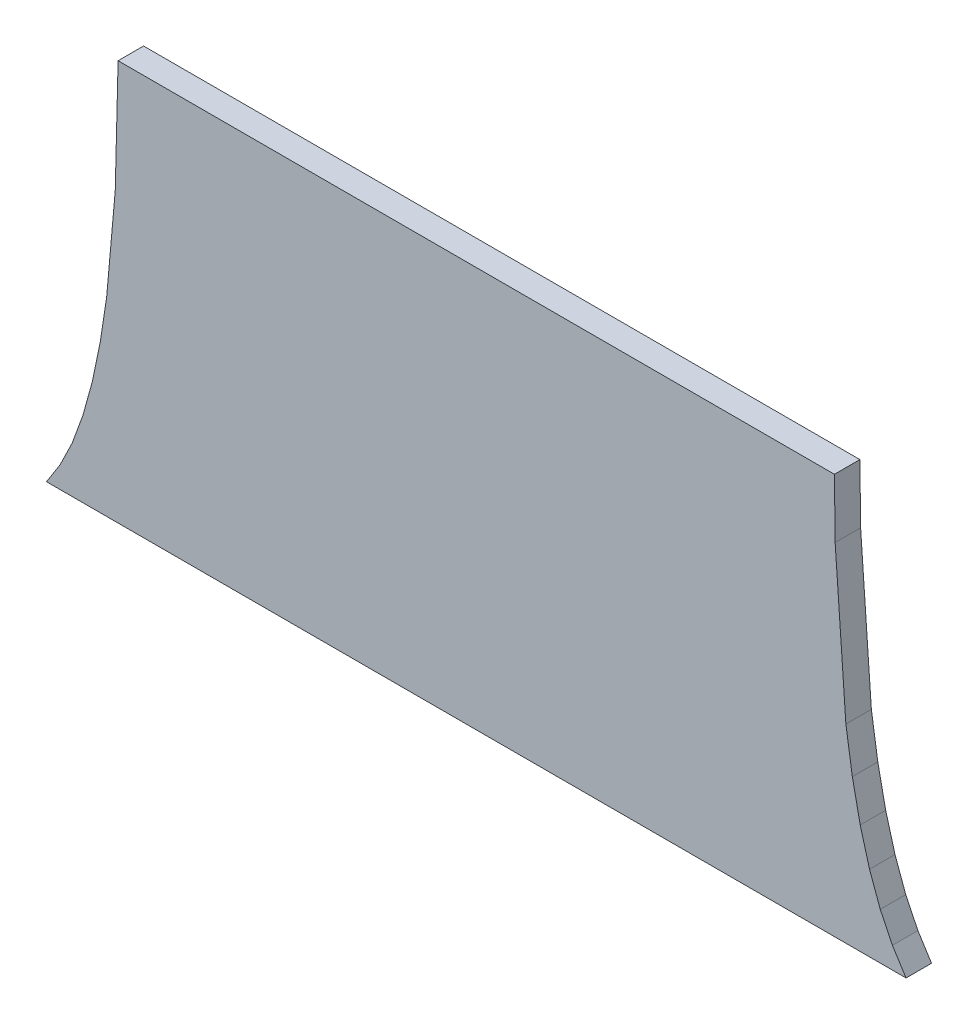
ISO-10303-21;
HEADER;
FILE_DESCRIPTION(('STEP AP214'),'2;1');
FILE_NAME('part.step','',(''),(''),'','','');
FILE_SCHEMA(('AUTOMOTIVE_DESIGN { 1 0 10303 214 1 1 1 1 }'));
ENDSEC;
DATA;
#1=APPLICATION_CONTEXT('core data for automotive mechanical design processes');
#2=APPLICATION_PROTOCOL_DEFINITION('international standard','automotive_design',2000,#1);
#3=PRODUCT_CONTEXT('',#1,'mechanical');
#4=PRODUCT('Part','Part','',(#3));
#5=PRODUCT_RELATED_PRODUCT_CATEGORY('part','',(#4));
#6=PRODUCT_DEFINITION_FORMATION('','',#4);
#7=PRODUCT_DEFINITION_CONTEXT('part definition',#1,'design');
#8=PRODUCT_DEFINITION('design','',#6,#7);
#9=PRODUCT_DEFINITION_SHAPE('','',#8);
#10=(LENGTH_UNIT() NAMED_UNIT(*) SI_UNIT(.MILLI.,.METRE.));
#11=(NAMED_UNIT(*) PLANE_ANGLE_UNIT() SI_UNIT($,.RADIAN.));
#12=(NAMED_UNIT(*) SI_UNIT($,.STERADIAN.) SOLID_ANGLE_UNIT());
#13=UNCERTAINTY_MEASURE_WITH_UNIT(LENGTH_MEASURE(1.E-05),#10,'distance_accuracy_value','');
#14=(GEOMETRIC_REPRESENTATION_CONTEXT(3) GLOBAL_UNCERTAINTY_ASSIGNED_CONTEXT((#13)) GLOBAL_UNIT_ASSIGNED_CONTEXT((#10,
#11,#12)) REPRESENTATION_CONTEXT('',''));
#15=CARTESIAN_POINT('',(0.,0.,0.));
#16=DIRECTION('',(0.,0.,1.));
#17=DIRECTION('',(1.,0.,0.));
#18=AXIS2_PLACEMENT_3D('',#15,#16,#17);
#19=CARTESIAN_POINT('',(68.4000015258789,39.5089988708496,0.));
#20=DIRECTION('',(0.999684055752358,-0.0251354067903474,0.));
#21=DIRECTION('',(-0.0251354067903474,-0.999684055752358,0.));
#22=AXIS2_PLACEMENT_3D('',#19,#20,#21);
#23=PLANE('',#22);
#24=DIRECTION('',(-0.0251354067903474,-0.999684055752358,0.));
#25=VECTOR('',#24,1.);
#26=CARTESIAN_POINT('',(68.4000015258789,39.5089988708496,0.03556));
#27=LINE('',#26,#25);
#28=CARTESIAN_POINT('',(68.4000015258789,39.5089988708496,0.03556));
#29=VERTEX_POINT('',#28);
#30=CARTESIAN_POINT('',(68.3960037231445,39.3499984741211,0.03556));
#31=VERTEX_POINT('',#30);
#32=EDGE_CURVE('E11',#29,#31,#27,.T.);
#33=ORIENTED_EDGE('',*,*,#32,.F.);
#34=DIRECTION('',(0.,0.,1.));
#35=VECTOR('',#34,1.);
#36=CARTESIAN_POINT('',(68.4000015258789,39.5089988708496,0.));
#37=LINE('',#36,#35);
#38=CARTESIAN_POINT('',(68.4000015258789,39.5089988708496,0.));
#39=VERTEX_POINT('',#38);
#40=EDGE_CURVE('E24',#39,#29,#37,.T.);
#41=ORIENTED_EDGE('',*,*,#40,.F.);
#42=DIRECTION('',(-0.0251354067903474,-0.999684055752358,0.));
#43=VECTOR('',#42,1.);
#44=CARTESIAN_POINT('',(68.4000015258789,39.5089988708496,0.));
#45=LINE('',#44,#43);
#46=CARTESIAN_POINT('',(68.3960037231445,39.3499984741211,0.));
#47=VERTEX_POINT('',#46);
#48=EDGE_CURVE('E160',#39,#47,#45,.T.);
#49=ORIENTED_EDGE('',*,*,#48,.T.);
#50=DIRECTION('',(0.,0.,1.));
#51=VECTOR('',#50,1.);
#52=CARTESIAN_POINT('',(68.3960037231445,39.3499984741211,0.));
#53=LINE('',#52,#51);
#54=EDGE_CURVE('E37',#47,#31,#53,.T.);
#55=ORIENTED_EDGE('',*,*,#54,.T.);
#56=EDGE_LOOP('',(#33,#41,#49,#55));
#57=FACE_BOUND('',#56,.T.);
#58=ADVANCED_FACE('F17',(#57),#23,.F.);
#59=CARTESIAN_POINT('',(68.3960037231445,39.3499984741211,0.));
#60=DIRECTION('',(0.996071868387923,-0.0885484782827547,0.));
#61=DIRECTION('',(-0.0885484782827547,-0.996071868387923,0.));
#62=AXIS2_PLACEMENT_3D('',#59,#60,#61);
#63=PLANE('',#62);
#64=DIRECTION('',(-0.0885484782827547,-0.996071868387923,0.));
#65=VECTOR('',#64,1.);
#66=CARTESIAN_POINT('',(68.3960037231445,39.3499984741211,0.03556));
#67=LINE('',#66,#65);
#68=CARTESIAN_POINT('',(68.3840026855469,39.2150001525879,0.03556));
#69=VERTEX_POINT('',#68);
#70=EDGE_CURVE('E280',#31,#69,#67,.T.);
#71=ORIENTED_EDGE('',*,*,#70,.F.);
#72=ORIENTED_EDGE('',*,*,#54,.F.);
#73=DIRECTION('',(-0.0885484782827547,-0.996071868387923,0.));
#74=VECTOR('',#73,1.);
#75=CARTESIAN_POINT('',(68.3960037231445,39.3499984741211,0.));
#76=LINE('',#75,#74);
#77=CARTESIAN_POINT('',(68.3840026855469,39.2150001525879,0.));
#78=VERTEX_POINT('',#77);
#79=EDGE_CURVE('E277',#47,#78,#76,.T.);
#80=ORIENTED_EDGE('',*,*,#79,.T.);
#81=DIRECTION('',(0.,0.,1.));
#82=VECTOR('',#81,1.);
#83=CARTESIAN_POINT('',(68.3840026855469,39.2150001525879,0.));
#84=LINE('',#83,#82);
#85=EDGE_CURVE('E275',#78,#69,#84,.T.);
#86=ORIENTED_EDGE('',*,*,#85,.T.);
#87=EDGE_LOOP('',(#71,#72,#80,#86));
#88=FACE_BOUND('',#87,.T.);
#89=ADVANCED_FACE('F288',(#88),#63,.F.);
#90=CARTESIAN_POINT('',(68.3840026855469,39.2150001525879,0.));
#91=DIRECTION('',(0.988558623060586,-0.150837159786835,0.));
#92=DIRECTION('',(-0.150837159786835,-0.988558623060586,0.));
#93=AXIS2_PLACEMENT_3D('',#90,#91,#92);
#94=PLANE('',#93);
#95=DIRECTION('',(-0.150837159786835,-0.988558623060586,0.));
#96=VECTOR('',#95,1.);
#97=CARTESIAN_POINT('',(68.3840026855469,39.2150001525879,0.03556));
#98=LINE('',#97,#96);
#99=CARTESIAN_POINT('',(68.375,39.1559982299805,0.03556));
#100=VERTEX_POINT('',#99);
#101=EDGE_CURVE('E272',#69,#100,#98,.T.);
#102=ORIENTED_EDGE('',*,*,#101,.F.);
#103=ORIENTED_EDGE('',*,*,#85,.F.);
#104=DIRECTION('',(-0.150837159786835,-0.988558623060586,0.));
#105=VECTOR('',#104,1.);
#106=CARTESIAN_POINT('',(68.3840026855469,39.2150001525879,0.));
#107=LINE('',#106,#105);
#108=CARTESIAN_POINT('',(68.375,39.1559982299805,0.));
#109=VERTEX_POINT('',#108);
#110=EDGE_CURVE('E269',#78,#109,#107,.T.);
#111=ORIENTED_EDGE('',*,*,#110,.T.);
#112=DIRECTION('',(0.,0.,1.));
#113=VECTOR('',#112,1.);
#114=CARTESIAN_POINT('',(68.375,39.1559982299805,0.));
#115=LINE('',#114,#113);
#116=EDGE_CURVE('E267',#109,#100,#115,.T.);
#117=ORIENTED_EDGE('',*,*,#116,.T.);
#118=EDGE_LOOP('',(#102,#103,#111,#117));
#119=FACE_BOUND('',#118,.T.);
#120=ADVANCED_FACE('F294',(#119),#94,.F.);
#121=CARTESIAN_POINT('',(68.375,39.1559982299805,0.));
#122=DIRECTION('',(0.979126163760233,-0.2032534266382,0.));
#123=DIRECTION('',(-0.2032534266382,-0.979126163760233,0.));
#124=AXIS2_PLACEMENT_3D('',#121,#122,#123);
#125=PLANE('',#124);
#126=DIRECTION('',(-0.2032534266382,-0.979126163760233,0.));
#127=VECTOR('',#126,1.);
#128=CARTESIAN_POINT('',(68.375,39.1559982299805,0.03556));
#129=LINE('',#128,#127);
#130=CARTESIAN_POINT('',(68.3639984130859,39.1030006408691,0.03556));
#131=VERTEX_POINT('',#130);
#132=EDGE_CURVE('E264',#100,#131,#129,.T.);
#133=ORIENTED_EDGE('',*,*,#132,.F.);
#134=ORIENTED_EDGE('',*,*,#116,.F.);
#135=DIRECTION('',(-0.2032534266382,-0.979126163760233,0.));
#136=VECTOR('',#135,1.);
#137=CARTESIAN_POINT('',(68.375,39.1559982299805,0.));
#138=LINE('',#137,#136);
#139=CARTESIAN_POINT('',(68.3639984130859,39.1030006408691,0.));
#140=VERTEX_POINT('',#139);
#141=EDGE_CURVE('E261',#109,#140,#138,.T.);
#142=ORIENTED_EDGE('',*,*,#141,.T.);
#143=DIRECTION('',(0.,0.,1.));
#144=VECTOR('',#143,1.);
#145=CARTESIAN_POINT('',(68.3639984130859,39.1030006408691,0.));
#146=LINE('',#145,#144);
#147=EDGE_CURVE('E259',#140,#131,#146,.T.);
#148=ORIENTED_EDGE('',*,*,#147,.T.);
#149=EDGE_LOOP('',(#133,#134,#142,#148));
#150=FACE_BOUND('',#149,.T.);
#151=ADVANCED_FACE('F296',(#150),#125,.F.);
#152=CARTESIAN_POINT('',(68.3639984130859,39.1030006408691,0.));
#153=DIRECTION('',(0.963809837327237,-0.266590692769355,0.));
#154=DIRECTION('',(-0.266590692769355,-0.963809837327237,0.));
#155=AXIS2_PLACEMENT_3D('',#152,#153,#154);
#156=PLANE('',#155);
#157=DIRECTION('',(-0.266590692769355,-0.963809837327237,0.));
#158=VECTOR('',#157,1.);
#159=CARTESIAN_POINT('',(68.3639984130859,39.1030006408691,0.03556));
#160=LINE('',#159,#158);
#161=CARTESIAN_POINT('',(68.3509979248047,39.0559997558594,0.03556));
#162=VERTEX_POINT('',#161);
#163=EDGE_CURVE('E256',#131,#162,#160,.T.);
#164=ORIENTED_EDGE('',*,*,#163,.F.);
#165=ORIENTED_EDGE('',*,*,#147,.F.);
#166=DIRECTION('',(-0.266590692769355,-0.963809837327237,0.));
#167=VECTOR('',#166,1.);
#168=CARTESIAN_POINT('',(68.3639984130859,39.1030006408691,0.));
#169=LINE('',#168,#167);
#170=CARTESIAN_POINT('',(68.3509979248047,39.0559997558594,0.));
#171=VERTEX_POINT('',#170);
#172=EDGE_CURVE('E253',#140,#171,#169,.T.);
#173=ORIENTED_EDGE('',*,*,#172,.T.);
#174=DIRECTION('',(0.,0.,1.));
#175=VECTOR('',#174,1.);
#176=CARTESIAN_POINT('',(68.3509979248047,39.0559997558594,0.));
#177=LINE('',#176,#175);
#178=EDGE_CURVE('E251',#171,#162,#177,.T.);
#179=ORIENTED_EDGE('',*,*,#178,.T.);
#180=EDGE_LOOP('',(#164,#165,#173,#179));
#181=FACE_BOUND('',#180,.T.);
#182=ADVANCED_FACE('F301',(#181),#156,.F.);
#183=CARTESIAN_POINT('',(68.3509979248047,39.0559997558594,0.));
#184=DIRECTION('',(0.939128353177272,-0.343566494668128,0.));
#185=DIRECTION('',(-0.343566494668128,-0.939128353177272,0.));
#186=AXIS2_PLACEMENT_3D('',#183,#184,#185);
#187=PLANE('',#186);
#188=DIRECTION('',(-0.343566494668128,-0.939128353177272,0.));
#189=VECTOR('',#188,1.);
#190=CARTESIAN_POINT('',(68.3509979248047,39.0559997558594,0.03556));
#191=LINE('',#190,#189);
#192=CARTESIAN_POINT('',(68.3359985351562,39.0149993896484,0.03556));
#193=VERTEX_POINT('',#192);
#194=EDGE_CURVE('E248',#162,#193,#191,.T.);
#195=ORIENTED_EDGE('',*,*,#194,.F.);
#196=ORIENTED_EDGE('',*,*,#178,.F.);
#197=DIRECTION('',(-0.343566494668128,-0.939128353177272,0.));
#198=VECTOR('',#197,1.);
#199=CARTESIAN_POINT('',(68.3509979248047,39.0559997558594,0.));
#200=LINE('',#199,#198);
#201=CARTESIAN_POINT('',(68.3359985351562,39.0149993896484,0.));
#202=VERTEX_POINT('',#201);
#203=EDGE_CURVE('E245',#171,#202,#200,.T.);
#204=ORIENTED_EDGE('',*,*,#203,.T.);
#205=DIRECTION('',(0.,0.,1.));
#206=VECTOR('',#205,1.);
#207=CARTESIAN_POINT('',(68.3359985351562,39.0149993896484,0.));
#208=LINE('',#207,#206);
#209=EDGE_CURVE('E243',#202,#193,#208,.T.);
#210=ORIENTED_EDGE('',*,*,#209,.T.);
#211=EDGE_LOOP('',(#195,#196,#204,#210));
#212=FACE_BOUND('',#211,.T.);
#213=ADVANCED_FACE('F304',(#212),#187,.F.);
#214=CARTESIAN_POINT('',(68.3359985351562,39.0149993896484,0.));
#215=DIRECTION('',(0.89952467075599,-0.43686996543746,0.));
#216=DIRECTION('',(-0.43686996543746,-0.89952467075599,0.));
#217=AXIS2_PLACEMENT_3D('',#214,#215,#216);
#218=PLANE('',#217);
#219=DIRECTION('',(-0.43686996543746,-0.89952467075599,0.));
#220=VECTOR('',#219,1.);
#221=CARTESIAN_POINT('',(68.3359985351562,39.0149993896484,0.03556));
#222=LINE('',#221,#220);
#223=CARTESIAN_POINT('',(68.3190002441406,38.9799995422363,0.03556));
#224=VERTEX_POINT('',#223);
#225=EDGE_CURVE('E240',#193,#224,#222,.T.);
#226=ORIENTED_EDGE('',*,*,#225,.F.);
#227=ORIENTED_EDGE('',*,*,#209,.F.);
#228=DIRECTION('',(-0.43686996543746,-0.89952467075599,0.));
#229=VECTOR('',#228,1.);
#230=CARTESIAN_POINT('',(68.3359985351562,39.0149993896484,0.));
#231=LINE('',#230,#229);
#232=CARTESIAN_POINT('',(68.3190002441406,38.9799995422363,0.));
#233=VERTEX_POINT('',#232);
#234=EDGE_CURVE('E237',#202,#233,#231,.T.);
#235=ORIENTED_EDGE('',*,*,#234,.T.);
#236=DIRECTION('',(0.,0.,1.));
#237=VECTOR('',#236,1.);
#238=CARTESIAN_POINT('',(68.3190002441406,38.9799995422363,0.));
#239=LINE('',#238,#237);
#240=EDGE_CURVE('E235',#233,#224,#239,.T.);
#241=ORIENTED_EDGE('',*,*,#240,.T.);
#242=EDGE_LOOP('',(#226,#227,#235,#241));
#243=FACE_BOUND('',#242,.T.);
#244=ADVANCED_FACE('F309',(#243),#218,.F.);
#245=CARTESIAN_POINT('',(68.3190002441406,38.9799995422363,0.));
#246=DIRECTION('',(0.844844974102474,-0.535011186550142,0.));
#247=DIRECTION('',(-0.535011186550142,-0.844844974102474,0.));
#248=AXIS2_PLACEMENT_3D('',#245,#246,#247);
#249=PLANE('',#248);
#250=DIRECTION('',(-0.535011186550142,-0.844844974102474,0.));
#251=VECTOR('',#250,1.);
#252=CARTESIAN_POINT('',(68.3190002441406,38.9799995422363,0.03556));
#253=LINE('',#252,#251);
#254=CARTESIAN_POINT('',(68.3000030517578,38.9500007629395,0.03556));
#255=VERTEX_POINT('',#254);
#256=EDGE_CURVE('E232',#224,#255,#253,.T.);
#257=ORIENTED_EDGE('',*,*,#256,.F.);
#258=ORIENTED_EDGE('',*,*,#240,.F.);
#259=DIRECTION('',(-0.535011186550142,-0.844844974102474,0.));
#260=VECTOR('',#259,1.);
#261=CARTESIAN_POINT('',(68.3190002441406,38.9799995422363,0.));
#262=LINE('',#261,#260);
#263=CARTESIAN_POINT('',(68.3000030517578,38.9500007629395,0.));
#264=VERTEX_POINT('',#263);
#265=EDGE_CURVE('E229',#233,#264,#262,.T.);
#266=ORIENTED_EDGE('',*,*,#265,.T.);
#267=DIRECTION('',(0.,0.,1.));
#268=VECTOR('',#267,1.);
#269=CARTESIAN_POINT('',(68.3000030517578,38.9500007629395,0.));
#270=LINE('',#269,#268);
#271=EDGE_CURVE('E227',#264,#255,#270,.T.);
#272=ORIENTED_EDGE('',*,*,#271,.T.);
#273=EDGE_LOOP('',(#257,#258,#266,#272));
#274=FACE_BOUND('',#273,.T.);
#275=ADVANCED_FACE('F312',(#274),#249,.F.);
#276=CARTESIAN_POINT('',(68.3000030517578,38.9500007629395,0.));
#277=DIRECTION('',(0.,1.,0.));
#278=DIRECTION('',(1.,0.,0.));
#279=AXIS2_PLACEMENT_3D('',#276,#277,#278);
#280=PLANE('',#279);
#281=DIRECTION('',(1.,0.,0.));
#282=VECTOR('',#281,1.);
#283=CARTESIAN_POINT('',(68.3000030517578,38.9500007629395,0.03556));
#284=LINE('',#283,#282);
#285=CARTESIAN_POINT('',(69.5,38.9500007629395,0.03556));
#286=VERTEX_POINT('',#285);
#287=EDGE_CURVE('E224',#255,#286,#284,.T.);
#288=ORIENTED_EDGE('',*,*,#287,.F.);
#289=ORIENTED_EDGE('',*,*,#271,.F.);
#290=DIRECTION('',(1.,0.,0.));
#291=VECTOR('',#290,1.);
#292=CARTESIAN_POINT('',(68.3000030517578,38.9500007629395,0.));
#293=LINE('',#292,#291);
#294=CARTESIAN_POINT('',(69.5,38.9500007629395,0.));
#295=VERTEX_POINT('',#294);
#296=EDGE_CURVE('E221',#264,#295,#293,.T.);
#297=ORIENTED_EDGE('',*,*,#296,.T.);
#298=DIRECTION('',(0.,0.,1.));
#299=VECTOR('',#298,1.);
#300=CARTESIAN_POINT('',(69.5,38.9500007629395,0.));
#301=LINE('',#300,#299);
#302=EDGE_CURVE('E219',#295,#286,#301,.T.);
#303=ORIENTED_EDGE('',*,*,#302,.T.);
#304=EDGE_LOOP('',(#288,#289,#297,#303));
#305=FACE_BOUND('',#304,.T.);
#306=ADVANCED_FACE('F317',(#305),#280,.F.);
#307=CARTESIAN_POINT('',(69.5,38.9500007629395,0.));
#308=DIRECTION('',(-0.844844974102474,-0.535011186550142,0.));
#309=DIRECTION('',(-0.535011186550142,0.844844974102474,0.));
#310=AXIS2_PLACEMENT_3D('',#307,#308,#309);
#311=PLANE('',#310);
#312=DIRECTION('',(-0.535011186550142,0.844844974102474,0.));
#313=VECTOR('',#312,1.);
#314=CARTESIAN_POINT('',(69.5,38.9500007629395,0.03556));
#315=LINE('',#314,#313);
#316=CARTESIAN_POINT('',(69.4810028076172,38.9799995422363,0.03556));
#317=VERTEX_POINT('',#316);
#318=EDGE_CURVE('E216',#286,#317,#315,.T.);
#319=ORIENTED_EDGE('',*,*,#318,.F.);
#320=ORIENTED_EDGE('',*,*,#302,.F.);
#321=DIRECTION('',(-0.535011186550142,0.844844974102474,0.));
#322=VECTOR('',#321,1.);
#323=CARTESIAN_POINT('',(69.5,38.9500007629395,0.));
#324=LINE('',#323,#322);
#325=CARTESIAN_POINT('',(69.4810028076172,38.9799995422363,0.));
#326=VERTEX_POINT('',#325);
#327=EDGE_CURVE('E213',#295,#326,#324,.T.);
#328=ORIENTED_EDGE('',*,*,#327,.T.);
#329=DIRECTION('',(0.,0.,1.));
#330=VECTOR('',#329,1.);
#331=CARTESIAN_POINT('',(69.4810028076172,38.9799995422363,0.));
#332=LINE('',#331,#330);
#333=EDGE_CURVE('E211',#326,#317,#332,.T.);
#334=ORIENTED_EDGE('',*,*,#333,.T.);
#335=EDGE_LOOP('',(#319,#320,#328,#334));
#336=FACE_BOUND('',#335,.T.);
#337=ADVANCED_FACE('F320',(#336),#311,.F.);
#338=CARTESIAN_POINT('',(69.4810028076172,38.9799995422363,0.));
#339=DIRECTION('',(-0.899447608111395,-0.437028603483444,0.));
#340=DIRECTION('',(-0.437028603483444,0.899447608111395,0.));
#341=AXIS2_PLACEMENT_3D('',#338,#339,#340);
#342=PLANE('',#341);
#343=DIRECTION('',(-0.437028603483444,0.899447608111395,0.));
#344=VECTOR('',#343,1.);
#345=CARTESIAN_POINT('',(69.4810028076172,38.9799995422363,0.03556));
#346=LINE('',#345,#344);
#347=CARTESIAN_POINT('',(69.463996887207,39.0149993896484,0.03556));
#348=VERTEX_POINT('',#347);
#349=EDGE_CURVE('E208',#317,#348,#346,.T.);
#350=ORIENTED_EDGE('',*,*,#349,.F.);
#351=ORIENTED_EDGE('',*,*,#333,.F.);
#352=DIRECTION('',(-0.437028603483444,0.899447608111395,0.));
#353=VECTOR('',#352,1.);
#354=CARTESIAN_POINT('',(69.4810028076172,38.9799995422363,0.));
#355=LINE('',#354,#353);
#356=CARTESIAN_POINT('',(69.463996887207,39.0149993896484,0.));
#357=VERTEX_POINT('',#356);
#358=EDGE_CURVE('E205',#326,#357,#355,.T.);
#359=ORIENTED_EDGE('',*,*,#358,.T.);
#360=DIRECTION('',(0.,0.,1.));
#361=VECTOR('',#360,1.);
#362=CARTESIAN_POINT('',(69.463996887207,39.0149993896484,0.));
#363=LINE('',#362,#361);
#364=EDGE_CURVE('E203',#357,#348,#363,.T.);
#365=ORIENTED_EDGE('',*,*,#364,.T.);
#366=EDGE_LOOP('',(#350,#351,#359,#365));
#367=FACE_BOUND('',#366,.T.);
#368=ADVANCED_FACE('F325',(#367),#342,.F.);
#369=CARTESIAN_POINT('',(69.463996887207,39.0149993896484,0.));
#370=DIRECTION('',(-0.939128353177272,-0.343566494668128,0.));
#371=DIRECTION('',(-0.343566494668128,0.939128353177272,0.));
#372=AXIS2_PLACEMENT_3D('',#369,#370,#371);
#373=PLANE('',#372);
#374=DIRECTION('',(-0.343566494668128,0.939128353177272,0.));
#375=VECTOR('',#374,1.);
#376=CARTESIAN_POINT('',(69.463996887207,39.0149993896484,0.03556));
#377=LINE('',#376,#375);
#378=CARTESIAN_POINT('',(69.4489974975586,39.0559997558594,0.03556));
#379=VERTEX_POINT('',#378);
#380=EDGE_CURVE('E200',#348,#379,#377,.T.);
#381=ORIENTED_EDGE('',*,*,#380,.F.);
#382=ORIENTED_EDGE('',*,*,#364,.F.);
#383=DIRECTION('',(-0.343566494668128,0.939128353177272,0.));
#384=VECTOR('',#383,1.);
#385=CARTESIAN_POINT('',(69.463996887207,39.0149993896484,0.));
#386=LINE('',#385,#384);
#387=CARTESIAN_POINT('',(69.4489974975586,39.0559997558594,0.));
#388=VERTEX_POINT('',#387);
#389=EDGE_CURVE('E197',#357,#388,#386,.T.);
#390=ORIENTED_EDGE('',*,*,#389,.T.);
#391=DIRECTION('',(0.,0.,1.));
#392=VECTOR('',#391,1.);
#393=CARTESIAN_POINT('',(69.4489974975586,39.0559997558594,0.));
#394=LINE('',#393,#392);
#395=EDGE_CURVE('E195',#388,#379,#394,.T.);
#396=ORIENTED_EDGE('',*,*,#395,.T.);
#397=EDGE_LOOP('',(#381,#382,#390,#396));
#398=FACE_BOUND('',#397,.T.);
#399=ADVANCED_FACE('F328',(#398),#373,.F.);
#400=CARTESIAN_POINT('',(69.4489974975586,39.0559997558594,0.));
#401=DIRECTION('',(-0.963809837327237,-0.266590692769355,0.));
#402=DIRECTION('',(-0.266590692769355,0.963809837327237,0.));
#403=AXIS2_PLACEMENT_3D('',#400,#401,#402);
#404=PLANE('',#403);
#405=DIRECTION('',(-0.266590692769355,0.963809837327237,0.));
#406=VECTOR('',#405,1.);
#407=CARTESIAN_POINT('',(69.4489974975586,39.0559997558594,0.03556));
#408=LINE('',#407,#406);
#409=CARTESIAN_POINT('',(69.4359970092773,39.1030006408691,0.03556));
#410=VERTEX_POINT('',#409);
#411=EDGE_CURVE('E192',#379,#410,#408,.T.);
#412=ORIENTED_EDGE('',*,*,#411,.F.);
#413=ORIENTED_EDGE('',*,*,#395,.F.);
#414=DIRECTION('',(-0.266590692769355,0.963809837327237,0.));
#415=VECTOR('',#414,1.);
#416=CARTESIAN_POINT('',(69.4489974975586,39.0559997558594,0.));
#417=LINE('',#416,#415);
#418=CARTESIAN_POINT('',(69.4359970092773,39.1030006408691,0.));
#419=VERTEX_POINT('',#418);
#420=EDGE_CURVE('E189',#388,#419,#417,.T.);
#421=ORIENTED_EDGE('',*,*,#420,.T.);
#422=DIRECTION('',(0.,0.,1.));
#423=VECTOR('',#422,1.);
#424=CARTESIAN_POINT('',(69.4359970092773,39.1030006408691,0.));
#425=LINE('',#424,#423);
#426=EDGE_CURVE('E187',#419,#410,#425,.T.);
#427=ORIENTED_EDGE('',*,*,#426,.T.);
#428=EDGE_LOOP('',(#412,#413,#421,#427));
#429=FACE_BOUND('',#428,.T.);
#430=ADVANCED_FACE('F333',(#429),#404,.F.);
#431=CARTESIAN_POINT('',(69.4359970092773,39.1030006408691,0.));
#432=DIRECTION('',(-0.979154206290098,-0.203118291407764,0.));
#433=DIRECTION('',(-0.203118291407764,0.979154206290098,0.));
#434=AXIS2_PLACEMENT_3D('',#431,#432,#433);
#435=PLANE('',#434);
#436=DIRECTION('',(-0.203118291407764,0.979154206290097,0.));
#437=VECTOR('',#436,1.);
#438=CARTESIAN_POINT('',(69.4359970092773,39.1030006408691,0.03556));
#439=LINE('',#438,#437);
#440=CARTESIAN_POINT('',(69.4250030517578,39.1559982299805,0.03556));
#441=VERTEX_POINT('',#440);
#442=EDGE_CURVE('E184',#410,#441,#439,.T.);
#443=ORIENTED_EDGE('',*,*,#442,.F.);
#444=ORIENTED_EDGE('',*,*,#426,.F.);
#445=DIRECTION('',(-0.203118291407764,0.979154206290097,0.));
#446=VECTOR('',#445,1.);
#447=CARTESIAN_POINT('',(69.4359970092773,39.1030006408691,0.));
#448=LINE('',#447,#446);
#449=CARTESIAN_POINT('',(69.4250030517578,39.1559982299805,0.));
#450=VERTEX_POINT('',#449);
#451=EDGE_CURVE('E181',#419,#450,#448,.T.);
#452=ORIENTED_EDGE('',*,*,#451,.T.);
#453=DIRECTION('',(0.,0.,1.));
#454=VECTOR('',#453,1.);
#455=CARTESIAN_POINT('',(69.4250030517578,39.1559982299805,0.));
#456=LINE('',#455,#454);
#457=EDGE_CURVE('E179',#450,#441,#456,.T.);
#458=ORIENTED_EDGE('',*,*,#457,.T.);
#459=EDGE_LOOP('',(#443,#444,#452,#458));
#460=FACE_BOUND('',#459,.T.);
#461=ADVANCED_FACE('F336',(#460),#435,.F.);
#462=CARTESIAN_POINT('',(69.4250030517578,39.1559982299805,0.));
#463=DIRECTION('',(-0.988558623060586,-0.150837159786835,0.));
#464=DIRECTION('',(-0.150837159786835,0.988558623060586,0.));
#465=AXIS2_PLACEMENT_3D('',#462,#463,#464);
#466=PLANE('',#465);
#467=DIRECTION('',(-0.150837159786835,0.988558623060586,0.));
#468=VECTOR('',#467,1.);
#469=CARTESIAN_POINT('',(69.4250030517578,39.1559982299805,0.03556));
#470=LINE('',#469,#468);
#471=CARTESIAN_POINT('',(69.4160003662109,39.2150001525879,0.03556));
#472=VERTEX_POINT('',#471);
#473=EDGE_CURVE('E176',#441,#472,#470,.T.);
#474=ORIENTED_EDGE('',*,*,#473,.F.);
#475=ORIENTED_EDGE('',*,*,#457,.F.);
#476=DIRECTION('',(-0.150837159786835,0.988558623060586,0.));
#477=VECTOR('',#476,1.);
#478=CARTESIAN_POINT('',(69.4250030517578,39.1559982299805,0.));
#479=LINE('',#478,#477);
#480=CARTESIAN_POINT('',(69.4160003662109,39.2150001525879,0.));
#481=VERTEX_POINT('',#480);
#482=EDGE_CURVE('E173',#450,#481,#479,.T.);
#483=ORIENTED_EDGE('',*,*,#482,.T.);
#484=DIRECTION('',(0.,0.,1.));
#485=VECTOR('',#484,1.);
#486=CARTESIAN_POINT('',(69.4160003662109,39.2150001525879,0.));
#487=LINE('',#486,#485);
#488=EDGE_CURVE('E171',#481,#472,#487,.T.);
#489=ORIENTED_EDGE('',*,*,#488,.T.);
#490=EDGE_LOOP('',(#474,#475,#483,#489));
#491=FACE_BOUND('',#490,.T.);
#492=ADVANCED_FACE('F341',(#491),#466,.F.);
#493=CARTESIAN_POINT('',(69.4160003662109,39.2150001525879,0.));
#494=DIRECTION('',(-0.997506399326628,-0.0705760816596304,0.));
#495=DIRECTION('',(-0.0705760816596304,0.997506399326628,0.));
#496=AXIS2_PLACEMENT_3D('',#493,#494,#495);
#497=PLANE('',#496);
#498=DIRECTION('',(-0.0705760816596304,0.997506399326628,0.));
#499=VECTOR('',#498,1.);
#500=CARTESIAN_POINT('',(69.4160003662109,39.2150001525879,0.03556));
#501=LINE('',#500,#499);
#502=CARTESIAN_POINT('',(69.4010009765625,39.4269981384277,0.03556));
#503=VERTEX_POINT('',#502);
#504=EDGE_CURVE('E168',#472,#503,#501,.T.);
#505=ORIENTED_EDGE('',*,*,#504,.F.);
#506=ORIENTED_EDGE('',*,*,#488,.F.);
#507=DIRECTION('',(-0.0705760816596304,0.997506399326628,0.));
#508=VECTOR('',#507,1.);
#509=CARTESIAN_POINT('',(69.4160003662109,39.2150001525879,0.));
#510=LINE('',#509,#508);
#511=CARTESIAN_POINT('',(69.4010009765625,39.4269981384277,0.));
#512=VERTEX_POINT('',#511);
#513=EDGE_CURVE('E166',#481,#512,#510,.T.);
#514=ORIENTED_EDGE('',*,*,#513,.T.);
#515=DIRECTION('',(0.,0.,1.));
#516=VECTOR('',#515,1.);
#517=CARTESIAN_POINT('',(69.4010009765625,39.4269981384277,0.));
#518=LINE('',#517,#516);
#519=EDGE_CURVE('E151',#512,#503,#518,.T.);
#520=ORIENTED_EDGE('',*,*,#519,.T.);
#521=EDGE_LOOP('',(#505,#506,#514,#520));
#522=FACE_BOUND('',#521,.T.);
#523=ADVANCED_FACE('F343',(#522),#497,.F.);
#524=CARTESIAN_POINT('',(69.4010009765625,39.4269981384277,0.));
#525=DIRECTION('',(-0.999925730774336,-0.012187408888299,0.));
#526=DIRECTION('',(-0.012187408888299,0.999925730774336,0.));
#527=AXIS2_PLACEMENT_3D('',#524,#525,#526);
#528=PLANE('',#527);
#529=DIRECTION('',(-0.012187408888299,0.999925730774336,0.));
#530=VECTOR('',#529,1.);
#531=CARTESIAN_POINT('',(69.4010009765625,39.4269981384277,0.03556));
#532=LINE('',#531,#530);
#533=CARTESIAN_POINT('',(69.4000015258789,39.5089988708496,0.03556));
#534=VERTEX_POINT('',#533);
#535=EDGE_CURVE('E155',#503,#534,#532,.T.);
#536=ORIENTED_EDGE('',*,*,#535,.F.);
#537=ORIENTED_EDGE('',*,*,#519,.F.);
#538=DIRECTION('',(-0.012187408888299,0.999925730774336,0.));
#539=VECTOR('',#538,1.);
#540=CARTESIAN_POINT('',(69.4010009765625,39.4269981384277,0.));
#541=LINE('',#540,#539);
#542=CARTESIAN_POINT('',(69.4000015258789,39.5089988708496,0.));
#543=VERTEX_POINT('',#542);
#544=EDGE_CURVE('E147',#512,#543,#541,.T.);
#545=ORIENTED_EDGE('',*,*,#544,.T.);
#546=DIRECTION('',(0.,0.,1.));
#547=VECTOR('',#546,1.);
#548=CARTESIAN_POINT('',(69.4000015258789,39.5089988708496,0.));
#549=LINE('',#548,#547);
#550=EDGE_CURVE('E137',#543,#534,#549,.T.);
#551=ORIENTED_EDGE('',*,*,#550,.T.);
#552=EDGE_LOOP('',(#536,#537,#545,#551));
#553=FACE_BOUND('',#552,.T.);
#554=ADVANCED_FACE('F150',(#553),#528,.F.);
#555=CARTESIAN_POINT('',(69.4000015258789,39.5089988708496,0.));
#556=DIRECTION('',(0.,-1.,0.));
#557=DIRECTION('',(-1.,0.,0.));
#558=AXIS2_PLACEMENT_3D('',#555,#556,#557);
#559=PLANE('',#558);
#560=DIRECTION('',(-1.,0.,0.));
#561=VECTOR('',#560,1.);
#562=CARTESIAN_POINT('',(69.4000015258789,39.5089988708496,0.03556));
#563=LINE('',#562,#561);
#564=EDGE_CURVE('E143',#534,#29,#563,.T.);
#565=ORIENTED_EDGE('',*,*,#564,.F.);
#566=ORIENTED_EDGE('',*,*,#550,.F.);
#567=DIRECTION('',(-1.,0.,0.));
#568=VECTOR('',#567,1.);
#569=CARTESIAN_POINT('',(69.4000015258789,39.5089988708496,0.));
#570=LINE('',#569,#568);
#571=EDGE_CURVE('E141',#543,#39,#570,.T.);
#572=ORIENTED_EDGE('',*,*,#571,.T.);
#573=ORIENTED_EDGE('',*,*,#40,.T.);
#574=EDGE_LOOP('',(#565,#566,#572,#573));
#575=FACE_BOUND('',#574,.T.);
#576=ADVANCED_FACE('F139',(#575),#559,.F.);
#577=CARTESIAN_POINT('',(68.4000015258789,39.5089988708496,0.));
#578=DIRECTION('',(0.,0.,1.));
#579=DIRECTION('',(1.,0.,0.));
#580=AXIS2_PLACEMENT_3D('',#577,#578,#579);
#581=PLANE('',#580);
#582=ORIENTED_EDGE('',*,*,#571,.F.);
#583=ORIENTED_EDGE('',*,*,#544,.F.);
#584=ORIENTED_EDGE('',*,*,#513,.F.);
#585=ORIENTED_EDGE('',*,*,#482,.F.);
#586=ORIENTED_EDGE('',*,*,#451,.F.);
#587=ORIENTED_EDGE('',*,*,#420,.F.);
#588=ORIENTED_EDGE('',*,*,#389,.F.);
#589=ORIENTED_EDGE('',*,*,#358,.F.);
#590=ORIENTED_EDGE('',*,*,#327,.F.);
#591=ORIENTED_EDGE('',*,*,#296,.F.);
#592=ORIENTED_EDGE('',*,*,#265,.F.);
#593=ORIENTED_EDGE('',*,*,#234,.F.);
#594=ORIENTED_EDGE('',*,*,#203,.F.);
#595=ORIENTED_EDGE('',*,*,#172,.F.);
#596=ORIENTED_EDGE('',*,*,#141,.F.);
#597=ORIENTED_EDGE('',*,*,#110,.F.);
#598=ORIENTED_EDGE('',*,*,#79,.F.);
#599=ORIENTED_EDGE('',*,*,#48,.F.);
#600=EDGE_LOOP('',(#582,#583,#584,#585,#586,#587,#588,#589,#590,#591,#592,#593,#594,#595,#596,
#597,#598,#599));
#601=FACE_BOUND('',#600,.T.);
#602=ADVANCED_FACE('F158',(#601),#581,.F.);
#603=CARTESIAN_POINT('',(68.4000015258789,39.5089988708496,0.03556));
#604=DIRECTION('',(0.,0.,1.));
#605=DIRECTION('',(1.,0.,0.));
#606=AXIS2_PLACEMENT_3D('',#603,#604,#605);
#607=PLANE('',#606);
#608=ORIENTED_EDGE('',*,*,#32,.T.);
#609=ORIENTED_EDGE('',*,*,#70,.T.);
#610=ORIENTED_EDGE('',*,*,#101,.T.);
#611=ORIENTED_EDGE('',*,*,#132,.T.);
#612=ORIENTED_EDGE('',*,*,#163,.T.);
#613=ORIENTED_EDGE('',*,*,#194,.T.);
#614=ORIENTED_EDGE('',*,*,#225,.T.);
#615=ORIENTED_EDGE('',*,*,#256,.T.);
#616=ORIENTED_EDGE('',*,*,#287,.T.);
#617=ORIENTED_EDGE('',*,*,#318,.T.);
#618=ORIENTED_EDGE('',*,*,#349,.T.);
#619=ORIENTED_EDGE('',*,*,#380,.T.);
#620=ORIENTED_EDGE('',*,*,#411,.T.);
#621=ORIENTED_EDGE('',*,*,#442,.T.);
#622=ORIENTED_EDGE('',*,*,#473,.T.);
#623=ORIENTED_EDGE('',*,*,#504,.T.);
#624=ORIENTED_EDGE('',*,*,#535,.T.);
#625=ORIENTED_EDGE('',*,*,#564,.T.);
#626=EDGE_LOOP('',(#608,#609,#610,#611,#612,#613,#614,#615,#616,#617,#618,#619,#620,#621,#622,
#623,#624,#625));
#627=FACE_BOUND('',#626,.T.);
#628=ADVANCED_FACE('F291',(#627),#607,.T.);
#629=CLOSED_SHELL('',(#58,#89,#120,#151,#182,#213,#244,#275,#306,#337,#368,#399,#430,#461,#492,
#523,#554,#576,#602,#628));
#630=MANIFOLD_SOLID_BREP('B1',#629);
#631=ADVANCED_BREP_SHAPE_REPRESENTATION('',(#18,#630),#14);
#632=SHAPE_DEFINITION_REPRESENTATION(#9,#631);
ENDSEC;
END-ISO-10303-21;
